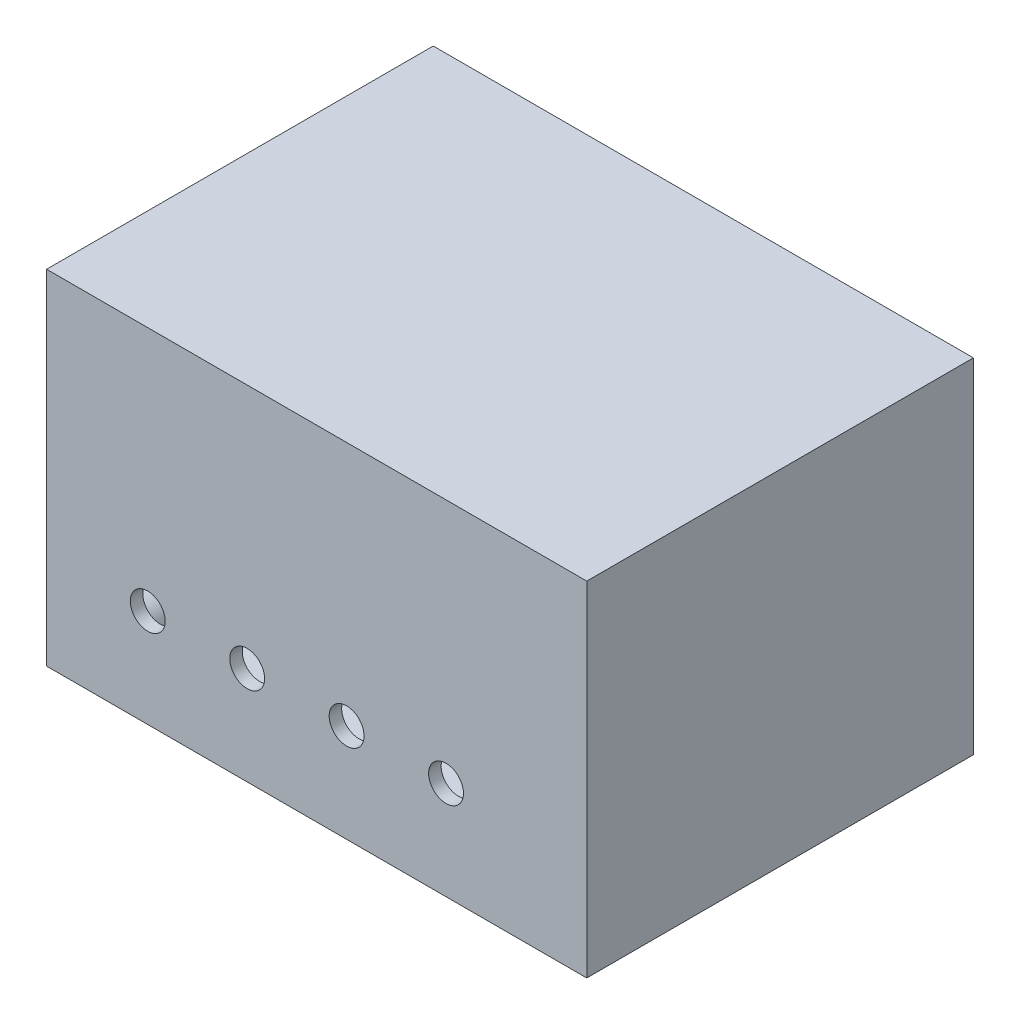
ISO-10303-21;
HEADER;
FILE_DESCRIPTION(('STEP AP214'),'2;1');
FILE_NAME('part.step','',(''),(''),'','','');
FILE_SCHEMA(('AUTOMOTIVE_DESIGN { 1 0 10303 214 1 1 1 1 }'));
ENDSEC;
DATA;
#1=APPLICATION_CONTEXT('core data for automotive mechanical design processes');
#2=APPLICATION_PROTOCOL_DEFINITION('international standard','automotive_design',2000,#1);
#3=PRODUCT_CONTEXT('',#1,'mechanical');
#4=PRODUCT('Part','Part','',(#3));
#5=PRODUCT_RELATED_PRODUCT_CATEGORY('part','',(#4));
#6=PRODUCT_DEFINITION_FORMATION('','',#4);
#7=PRODUCT_DEFINITION_CONTEXT('part definition',#1,'design');
#8=PRODUCT_DEFINITION('design','',#6,#7);
#9=PRODUCT_DEFINITION_SHAPE('','',#8);
#10=(LENGTH_UNIT() NAMED_UNIT(*) SI_UNIT(.MILLI.,.METRE.));
#11=(NAMED_UNIT(*) PLANE_ANGLE_UNIT() SI_UNIT($,.RADIAN.));
#12=(NAMED_UNIT(*) SI_UNIT($,.STERADIAN.) SOLID_ANGLE_UNIT());
#13=UNCERTAINTY_MEASURE_WITH_UNIT(LENGTH_MEASURE(1.E-05),#10,'distance_accuracy_value','');
#14=(GEOMETRIC_REPRESENTATION_CONTEXT(3) GLOBAL_UNCERTAINTY_ASSIGNED_CONTEXT((#13)) GLOBAL_UNIT_ASSIGNED_CONTEXT((#10,
#11,#12)) REPRESENTATION_CONTEXT('',''));
#15=CARTESIAN_POINT('',(0.,0.,0.));
#16=DIRECTION('',(0.,0.,1.));
#17=DIRECTION('',(1.,0.,0.));
#18=AXIS2_PLACEMENT_3D('',#15,#16,#17);
#19=CARTESIAN_POINT('',(-58.1808030552985,27.5798446644045,2.54));
#20=DIRECTION('',(1.,0.,0.));
#21=DIRECTION('',(0.,1.,0.));
#22=AXIS2_PLACEMENT_3D('',#19,#20,#21);
#23=PLANE('',#22);
#24=DIRECTION('',(0.,0.,-1.));
#25=VECTOR('',#24,1.);
#26=CARTESIAN_POINT('',(-58.1808030552985,27.5798446644045,2.54));
#27=LINE('',#26,#25);
#28=CARTESIAN_POINT('',(-58.1808030552985,27.5798446644045,2.54));
#29=VERTEX_POINT('',#28);
#30=CARTESIAN_POINT('',(-58.1808030552985,27.5798446644045,-76.2));
#31=VERTEX_POINT('',#30);
#32=EDGE_CURVE('E186',#29,#31,#27,.T.);
#33=ORIENTED_EDGE('',*,*,#32,.T.);
#34=DIRECTION('',(0.,1.,0.));
#35=VECTOR('',#34,1.);
#36=CARTESIAN_POINT('',(-58.1808030552985,-42.4201553355955,-76.2));
#37=LINE('',#36,#35);
#38=CARTESIAN_POINT('',(-58.1808030552985,-42.4201553355955,-76.2));
#39=VERTEX_POINT('',#38);
#40=EDGE_CURVE('E163',#39,#31,#37,.T.);
#41=ORIENTED_EDGE('',*,*,#40,.F.);
#42=DIRECTION('',(0.,0.,-1.));
#43=VECTOR('',#42,1.);
#44=CARTESIAN_POINT('',(-58.1808030552985,-42.4201553355955,2.54));
#45=LINE('',#44,#43);
#46=CARTESIAN_POINT('',(-58.1808030552985,-42.4201553355955,2.54));
#47=VERTEX_POINT('',#46);
#48=EDGE_CURVE('E195',#47,#39,#45,.T.);
#49=ORIENTED_EDGE('',*,*,#48,.F.);
#50=DIRECTION('',(0.,-1.,0.));
#51=VECTOR('',#50,1.);
#52=CARTESIAN_POINT('',(-58.1808030552985,27.5798446644045,2.54));
#53=LINE('',#52,#51);
#54=EDGE_CURVE('E175',#29,#47,#53,.T.);
#55=ORIENTED_EDGE('',*,*,#54,.F.);
#56=EDGE_LOOP('',(#33,#41,#49,#55));
#57=FACE_BOUND('',#56,.T.);
#58=ADVANCED_FACE('F39',(#57),#23,.F.);
#59=CARTESIAN_POINT('',(-58.1808030552985,-42.4201553355955,2.54));
#60=DIRECTION('',(0.,1.,0.));
#61=DIRECTION('',(0.,0.,1.));
#62=AXIS2_PLACEMENT_3D('',#59,#60,#61);
#63=PLANE('',#62);
#64=ORIENTED_EDGE('',*,*,#48,.T.);
#65=DIRECTION('',(-1.,0.,0.));
#66=VECTOR('',#65,1.);
#67=CARTESIAN_POINT('',(51.8191969447015,-42.4201553355955,-76.2));
#68=LINE('',#67,#66);
#69=CARTESIAN_POINT('',(51.8191969447015,-42.4201553355955,-76.2));
#70=VERTEX_POINT('',#69);
#71=EDGE_CURVE('E124',#70,#39,#68,.T.);
#72=ORIENTED_EDGE('',*,*,#71,.F.);
#73=DIRECTION('',(0.,0.,-1.));
#74=VECTOR('',#73,1.);
#75=CARTESIAN_POINT('',(51.8191969447015,-42.4201553355955,2.54));
#76=LINE('',#75,#74);
#77=CARTESIAN_POINT('',(51.8191969447015,-42.4201553355955,2.54));
#78=VERTEX_POINT('',#77);
#79=EDGE_CURVE('E192',#78,#70,#76,.T.);
#80=ORIENTED_EDGE('',*,*,#79,.F.);
#81=DIRECTION('',(1.,0.,0.));
#82=VECTOR('',#81,1.);
#83=CARTESIAN_POINT('',(-58.1808030552985,-42.4201553355955,2.54));
#84=LINE('',#83,#82);
#85=EDGE_CURVE('E178',#47,#78,#84,.T.);
#86=ORIENTED_EDGE('',*,*,#85,.F.);
#87=EDGE_LOOP('',(#64,#72,#80,#86));
#88=FACE_BOUND('',#87,.T.);
#89=ADVANCED_FACE('F236',(#88),#63,.F.);
#90=CARTESIAN_POINT('',(51.8191969447015,27.5798446644045,2.54));
#91=DIRECTION('',(-1.,0.,0.));
#92=DIRECTION('',(0.,-1.,0.));
#93=AXIS2_PLACEMENT_3D('',#90,#91,#92);
#94=PLANE('',#93);
#95=ORIENTED_EDGE('',*,*,#79,.T.);
#96=DIRECTION('',(0.,-1.,0.));
#97=VECTOR('',#96,1.);
#98=CARTESIAN_POINT('',(51.8191969447015,27.5798446644045,-76.2));
#99=LINE('',#98,#97);
#100=CARTESIAN_POINT('',(51.8191969447015,27.5798446644045,-76.2));
#101=VERTEX_POINT('',#100);
#102=EDGE_CURVE('E171',#101,#70,#99,.T.);
#103=ORIENTED_EDGE('',*,*,#102,.F.);
#104=DIRECTION('',(0.,0.,-1.));
#105=VECTOR('',#104,1.);
#106=CARTESIAN_POINT('',(51.8191969447015,27.5798446644045,2.54));
#107=LINE('',#106,#105);
#108=CARTESIAN_POINT('',(51.8191969447015,27.5798446644045,2.54));
#109=VERTEX_POINT('',#108);
#110=EDGE_CURVE('E189',#109,#101,#107,.T.);
#111=ORIENTED_EDGE('',*,*,#110,.F.);
#112=DIRECTION('',(0.,1.,0.));
#113=VECTOR('',#112,1.);
#114=CARTESIAN_POINT('',(51.8191969447015,27.5798446644045,2.54));
#115=LINE('',#114,#113);
#116=EDGE_CURVE('E181',#78,#109,#115,.T.);
#117=ORIENTED_EDGE('',*,*,#116,.F.);
#118=EDGE_LOOP('',(#95,#103,#111,#117));
#119=FACE_BOUND('',#118,.T.);
#120=ADVANCED_FACE('F241',(#119),#94,.F.);
#121=CARTESIAN_POINT('',(-58.1808030552985,27.5798446644045,2.54));
#122=DIRECTION('',(0.,-1.,0.));
#123=DIRECTION('',(0.,0.,-1.));
#124=AXIS2_PLACEMENT_3D('',#121,#122,#123);
#125=PLANE('',#124);
#126=ORIENTED_EDGE('',*,*,#110,.T.);
#127=DIRECTION('',(1.,0.,0.));
#128=VECTOR('',#127,1.);
#129=CARTESIAN_POINT('',(-58.1808030552985,27.5798446644045,-76.2));
#130=LINE('',#129,#128);
#131=EDGE_CURVE('E167',#31,#101,#130,.T.);
#132=ORIENTED_EDGE('',*,*,#131,.F.);
#133=ORIENTED_EDGE('',*,*,#32,.F.);
#134=DIRECTION('',(-1.,0.,0.));
#135=VECTOR('',#134,1.);
#136=CARTESIAN_POINT('',(-58.1808030552985,27.5798446644045,2.54));
#137=LINE('',#136,#135);
#138=EDGE_CURVE('E62',#109,#29,#137,.T.);
#139=ORIENTED_EDGE('',*,*,#138,.F.);
#140=EDGE_LOOP('',(#126,#132,#133,#139));
#141=FACE_BOUND('',#140,.T.);
#142=ADVANCED_FACE('F251',(#141),#125,.F.);
#143=CARTESIAN_POINT('',(0.,0.,2.54));
#144=DIRECTION('',(0.,0.,1.));
#145=DIRECTION('',(1.,0.,0.));
#146=AXIS2_PLACEMENT_3D('',#143,#144,#145);
#147=PLANE('',#146);
#148=CARTESIAN_POINT('',(23.1691969447015,-22.4201553355955,2.54));
#149=DIRECTION('',(0.,0.,1.));
#150=DIRECTION('',(1.,0.,0.));
#151=AXIS2_PLACEMENT_3D('',#148,#149,#150);
#152=CIRCLE('',#151,3.55);
#153=CARTESIAN_POINT('',(26.7191969447015,-22.4201553355955,2.54));
#154=VERTEX_POINT('',#153);
#155=EDGE_CURVE('E521',#154,#154,#152,.T.);
#156=ORIENTED_EDGE('',*,*,#155,.F.);
#157=EDGE_LOOP('',(#156));
#158=FACE_BOUND('',#157,.T.);
#159=CARTESIAN_POINT('',(2.91919694470147,-22.4201553355955,2.54));
#160=DIRECTION('',(0.,0.,1.));
#161=DIRECTION('',(1.,0.,0.));
#162=AXIS2_PLACEMENT_3D('',#159,#160,#161);
#163=CIRCLE('',#162,3.55);
#164=CARTESIAN_POINT('',(6.46919694470147,-22.4201553355955,2.54));
#165=VERTEX_POINT('',#164);
#166=EDGE_CURVE('E530',#165,#165,#163,.T.);
#167=ORIENTED_EDGE('',*,*,#166,.F.);
#168=EDGE_LOOP('',(#167));
#169=FACE_BOUND('',#168,.T.);
#170=CARTESIAN_POINT('',(-17.3308030552985,-22.4201553355955,2.54));
#171=DIRECTION('',(0.,0.,1.));
#172=DIRECTION('',(1.,0.,0.));
#173=AXIS2_PLACEMENT_3D('',#170,#171,#172);
#174=CIRCLE('',#173,3.55);
#175=CARTESIAN_POINT('',(-13.7808030552985,-22.4201553355955,2.54));
#176=VERTEX_POINT('',#175);
#177=EDGE_CURVE('E540',#176,#176,#174,.T.);
#178=ORIENTED_EDGE('',*,*,#177,.F.);
#179=EDGE_LOOP('',(#178));
#180=FACE_BOUND('',#179,.T.);
#181=CARTESIAN_POINT('',(-37.5808030552985,-22.4201553355955,2.54));
#182=DIRECTION('',(0.,0.,1.));
#183=DIRECTION('',(1.,0.,0.));
#184=AXIS2_PLACEMENT_3D('',#181,#182,#183);
#185=CIRCLE('',#184,3.55);
#186=CARTESIAN_POINT('',(-34.0308030552985,-22.4201553355955,2.54));
#187=VERTEX_POINT('',#186);
#188=EDGE_CURVE('E548',#187,#187,#185,.T.);
#189=ORIENTED_EDGE('',*,*,#188,.F.);
#190=EDGE_LOOP('',(#189));
#191=FACE_BOUND('',#190,.T.);
#192=ORIENTED_EDGE('',*,*,#54,.T.);
#193=ORIENTED_EDGE('',*,*,#85,.T.);
#194=ORIENTED_EDGE('',*,*,#116,.T.);
#195=ORIENTED_EDGE('',*,*,#138,.T.);
#196=EDGE_LOOP('',(#192,#193,#194,#195));
#197=FACE_BOUND('',#196,.T.);
#198=ADVANCED_FACE('F256',(#158,#169,#180,#191,#197),#147,.T.);
#199=CARTESIAN_POINT('',(0.,0.,-76.2));
#200=DIRECTION('',(0.,0.,-1.));
#201=DIRECTION('',(-1.,0.,0.));
#202=AXIS2_PLACEMENT_3D('',#199,#200,#201);
#203=PLANE('',#202);
#204=ORIENTED_EDGE('',*,*,#71,.T.);
#205=ORIENTED_EDGE('',*,*,#40,.T.);
#206=ORIENTED_EDGE('',*,*,#131,.T.);
#207=ORIENTED_EDGE('',*,*,#102,.T.);
#208=EDGE_LOOP('',(#204,#205,#206,#207));
#209=FACE_BOUND('',#208,.T.);
#210=DIRECTION('',(0.,1.,0.));
#211=VECTOR('',#210,1.);
#212=CARTESIAN_POINT('',(-55.6808030552985,-39.9201553355955,-76.2));
#213=LINE('',#212,#211);
#214=CARTESIAN_POINT('',(-55.6808030552985,-39.9201553355955,-76.2));
#215=VERTEX_POINT('',#214);
#216=CARTESIAN_POINT('',(-55.6808030552985,25.0798446644045,-76.2));
#217=VERTEX_POINT('',#216);
#218=EDGE_CURVE('E115',#215,#217,#213,.T.);
#219=ORIENTED_EDGE('',*,*,#218,.F.);
#220=DIRECTION('',(-1.,0.,0.));
#221=VECTOR('',#220,1.);
#222=CARTESIAN_POINT('',(49.3191969447015,-39.9201553355955,-76.2));
#223=LINE('',#222,#221);
#224=CARTESIAN_POINT('',(49.3191969447015,-39.9201553355955,-76.2));
#225=VERTEX_POINT('',#224);
#226=EDGE_CURVE('E106',#225,#215,#223,.T.);
#227=ORIENTED_EDGE('',*,*,#226,.F.);
#228=DIRECTION('',(0.,-1.,0.));
#229=VECTOR('',#228,1.);
#230=CARTESIAN_POINT('',(49.3191969447015,25.0798446644045,-76.2));
#231=LINE('',#230,#229);
#232=CARTESIAN_POINT('',(49.3191969447015,25.0798446644045,-76.2));
#233=VERTEX_POINT('',#232);
#234=EDGE_CURVE('E134',#233,#225,#231,.T.);
#235=ORIENTED_EDGE('',*,*,#234,.F.);
#236=DIRECTION('',(1.,0.,0.));
#237=VECTOR('',#236,1.);
#238=CARTESIAN_POINT('',(-55.6808030552985,25.0798446644045,-76.2));
#239=LINE('',#238,#237);
#240=EDGE_CURVE('E130',#217,#233,#239,.T.);
#241=ORIENTED_EDGE('',*,*,#240,.F.);
#242=EDGE_LOOP('',(#219,#227,#235,#241));
#243=FACE_BOUND('',#242,.T.);
#244=ADVANCED_FACE('F128',(#209,#243),#203,.T.);
#245=CARTESIAN_POINT('',(49.3191969447015,-39.9201553355955,-76.2));
#246=DIRECTION('',(0.,1.,0.));
#247=DIRECTION('',(-1.,0.,0.));
#248=AXIS2_PLACEMENT_3D('',#245,#246,#247);
#249=PLANE('',#248);
#250=DIRECTION('',(-1.,0.,0.));
#251=VECTOR('',#250,1.);
#252=CARTESIAN_POINT('',(49.3191969447015,-39.9201553355955,0.));
#253=LINE('',#252,#251);
#254=CARTESIAN_POINT('',(49.3191969447015,-39.9201553355955,0.));
#255=VERTEX_POINT('',#254);
#256=CARTESIAN_POINT('',(-55.6808030552985,-39.9201553355955,0.));
#257=VERTEX_POINT('',#256);
#258=EDGE_CURVE('E140',#255,#257,#253,.T.);
#259=ORIENTED_EDGE('',*,*,#258,.F.);
#260=DIRECTION('',(0.,0.,1.));
#261=VECTOR('',#260,1.);
#262=CARTESIAN_POINT('',(49.3191969447015,-39.9201553355955,-76.2));
#263=LINE('',#262,#261);
#264=EDGE_CURVE('E54',#225,#255,#263,.T.);
#265=ORIENTED_EDGE('',*,*,#264,.F.);
#266=ORIENTED_EDGE('',*,*,#226,.T.);
#267=DIRECTION('',(0.,0.,1.));
#268=VECTOR('',#267,1.);
#269=CARTESIAN_POINT('',(-55.6808030552985,-39.9201553355955,-76.2));
#270=LINE('',#269,#268);
#271=EDGE_CURVE('E109',#215,#257,#270,.T.);
#272=ORIENTED_EDGE('',*,*,#271,.T.);
#273=EDGE_LOOP('',(#259,#265,#266,#272));
#274=FACE_BOUND('',#273,.T.);
#275=ADVANCED_FACE('F108',(#274),#249,.T.);
#276=CARTESIAN_POINT('',(-55.6808030552985,-39.9201553355955,-76.2));
#277=DIRECTION('',(1.,0.,0.));
#278=DIRECTION('',(0.,1.,0.));
#279=AXIS2_PLACEMENT_3D('',#276,#277,#278);
#280=PLANE('',#279);
#281=DIRECTION('',(0.,1.,0.));
#282=VECTOR('',#281,1.);
#283=CARTESIAN_POINT('',(-55.6808030552985,-39.9201553355955,0.));
#284=LINE('',#283,#282);
#285=CARTESIAN_POINT('',(-55.6808030552985,25.0798446644045,0.));
#286=VERTEX_POINT('',#285);
#287=EDGE_CURVE('E122',#257,#286,#284,.T.);
#288=ORIENTED_EDGE('',*,*,#287,.F.);
#289=ORIENTED_EDGE('',*,*,#271,.F.);
#290=ORIENTED_EDGE('',*,*,#218,.T.);
#291=DIRECTION('',(0.,0.,1.));
#292=VECTOR('',#291,1.);
#293=CARTESIAN_POINT('',(-55.6808030552985,25.0798446644045,-76.2));
#294=LINE('',#293,#292);
#295=EDGE_CURVE('E125',#217,#286,#294,.T.);
#296=ORIENTED_EDGE('',*,*,#295,.T.);
#297=EDGE_LOOP('',(#288,#289,#290,#296));
#298=FACE_BOUND('',#297,.T.);
#299=ADVANCED_FACE('F119',(#298),#280,.T.);
#300=CARTESIAN_POINT('',(-55.6808030552985,25.0798446644045,-76.2));
#301=DIRECTION('',(0.,-1.,0.));
#302=DIRECTION('',(1.,0.,0.));
#303=AXIS2_PLACEMENT_3D('',#300,#301,#302);
#304=PLANE('',#303);
#305=DIRECTION('',(1.,0.,0.));
#306=VECTOR('',#305,1.);
#307=CARTESIAN_POINT('',(-55.6808030552985,25.0798446644045,0.));
#308=LINE('',#307,#306);
#309=CARTESIAN_POINT('',(49.3191969447015,25.0798446644045,0.));
#310=VERTEX_POINT('',#309);
#311=EDGE_CURVE('E146',#286,#310,#308,.T.);
#312=ORIENTED_EDGE('',*,*,#311,.F.);
#313=ORIENTED_EDGE('',*,*,#295,.F.);
#314=ORIENTED_EDGE('',*,*,#240,.T.);
#315=DIRECTION('',(0.,0.,1.));
#316=VECTOR('',#315,1.);
#317=CARTESIAN_POINT('',(49.3191969447015,25.0798446644045,-76.2));
#318=LINE('',#317,#316);
#319=EDGE_CURVE('E155',#233,#310,#318,.T.);
#320=ORIENTED_EDGE('',*,*,#319,.T.);
#321=EDGE_LOOP('',(#312,#313,#314,#320));
#322=FACE_BOUND('',#321,.T.);
#323=ADVANCED_FACE('F226',(#322),#304,.T.);
#324=CARTESIAN_POINT('',(49.3191969447015,25.0798446644045,-76.2));
#325=DIRECTION('',(-1.,0.,0.));
#326=DIRECTION('',(0.,-1.,0.));
#327=AXIS2_PLACEMENT_3D('',#324,#325,#326);
#328=PLANE('',#327);
#329=DIRECTION('',(0.,-1.,0.));
#330=VECTOR('',#329,1.);
#331=CARTESIAN_POINT('',(49.3191969447015,25.0798446644045,0.));
#332=LINE('',#331,#330);
#333=EDGE_CURVE('E116',#310,#255,#332,.T.);
#334=ORIENTED_EDGE('',*,*,#333,.F.);
#335=ORIENTED_EDGE('',*,*,#319,.F.);
#336=ORIENTED_EDGE('',*,*,#234,.T.);
#337=ORIENTED_EDGE('',*,*,#264,.T.);
#338=EDGE_LOOP('',(#334,#335,#336,#337));
#339=FACE_BOUND('',#338,.T.);
#340=ADVANCED_FACE('F215',(#339),#328,.T.);
#341=CARTESIAN_POINT('',(0.,0.,0.));
#342=DIRECTION('',(0.,0.,1.));
#343=DIRECTION('',(1.,0.,0.));
#344=AXIS2_PLACEMENT_3D('',#341,#342,#343);
#345=PLANE('',#344);
#346=CARTESIAN_POINT('',(23.1691969447015,-22.4201553355955,0.));
#347=DIRECTION('',(0.,0.,1.));
#348=DIRECTION('',(1.,0.,0.));
#349=AXIS2_PLACEMENT_3D('',#346,#347,#348);
#350=CIRCLE('',#349,3.55);
#351=CARTESIAN_POINT('',(26.7191969447015,-22.4201553355955,0.));
#352=VERTEX_POINT('',#351);
#353=EDGE_CURVE('E519',#352,#352,#350,.T.);
#354=ORIENTED_EDGE('',*,*,#353,.T.);
#355=EDGE_LOOP('',(#354));
#356=FACE_BOUND('',#355,.T.);
#357=CARTESIAN_POINT('',(2.91919694470147,-22.4201553355955,0.));
#358=DIRECTION('',(0.,0.,1.));
#359=DIRECTION('',(1.,0.,0.));
#360=AXIS2_PLACEMENT_3D('',#357,#358,#359);
#361=CIRCLE('',#360,3.55);
#362=CARTESIAN_POINT('',(6.46919694470147,-22.4201553355955,0.));
#363=VERTEX_POINT('',#362);
#364=EDGE_CURVE('E523',#363,#363,#361,.T.);
#365=ORIENTED_EDGE('',*,*,#364,.T.);
#366=EDGE_LOOP('',(#365));
#367=FACE_BOUND('',#366,.T.);
#368=CARTESIAN_POINT('',(-17.3308030552985,-22.4201553355955,0.));
#369=DIRECTION('',(0.,0.,1.));
#370=DIRECTION('',(1.,0.,0.));
#371=AXIS2_PLACEMENT_3D('',#368,#369,#370);
#372=CIRCLE('',#371,3.55);
#373=CARTESIAN_POINT('',(-13.7808030552985,-22.4201553355955,0.));
#374=VERTEX_POINT('',#373);
#375=EDGE_CURVE('E536',#374,#374,#372,.T.);
#376=ORIENTED_EDGE('',*,*,#375,.T.);
#377=EDGE_LOOP('',(#376));
#378=FACE_BOUND('',#377,.T.);
#379=CARTESIAN_POINT('',(-37.5808030552985,-22.4201553355955,0.));
#380=DIRECTION('',(0.,0.,1.));
#381=DIRECTION('',(1.,0.,0.));
#382=AXIS2_PLACEMENT_3D('',#379,#380,#381);
#383=CIRCLE('',#382,3.55);
#384=CARTESIAN_POINT('',(-34.0308030552985,-22.4201553355955,0.));
#385=VERTEX_POINT('',#384);
#386=EDGE_CURVE('E544',#385,#385,#383,.T.);
#387=ORIENTED_EDGE('',*,*,#386,.T.);
#388=EDGE_LOOP('',(#387));
#389=FACE_BOUND('',#388,.T.);
#390=CARTESIAN_POINT('',(43.8191969447015,-32.4201553355955,0.));
#391=DIRECTION('',(0.,0.,1.));
#392=DIRECTION('',(1.,0.,0.));
#393=AXIS2_PLACEMENT_3D('',#390,#391,#392);
#394=CIRCLE('',#393,5.31);
#395=CARTESIAN_POINT('',(49.1291969447014,-32.4201553355955,0.));
#396=VERTEX_POINT('',#395);
#397=EDGE_CURVE('E11',#396,#396,#394,.F.);
#398=ORIENTED_EDGE('',*,*,#397,.F.);
#399=EDGE_LOOP('',(#398));
#400=FACE_BOUND('',#399,.T.);
#401=CARTESIAN_POINT('',(-47.1808030552985,-32.4201553355955,0.));
#402=DIRECTION('',(0.,0.,1.));
#403=DIRECTION('',(1.,0.,0.));
#404=AXIS2_PLACEMENT_3D('',#401,#402,#403);
#405=CIRCLE('',#404,5.31);
#406=CARTESIAN_POINT('',(-41.8708030552985,-32.4201553355955,0.));
#407=VERTEX_POINT('',#406);
#408=EDGE_CURVE('E47',#407,#407,#405,.F.);
#409=ORIENTED_EDGE('',*,*,#408,.F.);
#410=EDGE_LOOP('',(#409));
#411=FACE_BOUND('',#410,.T.);
#412=CARTESIAN_POINT('',(-47.1808030552985,17.5798446644045,0.));
#413=DIRECTION('',(0.,0.,1.));
#414=DIRECTION('',(1.,0.,0.));
#415=AXIS2_PLACEMENT_3D('',#412,#413,#414);
#416=CIRCLE('',#415,5.31);
#417=CARTESIAN_POINT('',(-41.8708030552985,17.5798446644045,0.));
#418=VERTEX_POINT('',#417);
#419=EDGE_CURVE('E202',#418,#418,#416,.F.);
#420=ORIENTED_EDGE('',*,*,#419,.F.);
#421=EDGE_LOOP('',(#420));
#422=FACE_BOUND('',#421,.T.);
#423=CARTESIAN_POINT('',(43.8191969447015,17.5798446644045,0.));
#424=DIRECTION('',(0.,0.,1.));
#425=DIRECTION('',(1.,0.,0.));
#426=AXIS2_PLACEMENT_3D('',#423,#424,#425);
#427=CIRCLE('',#426,5.31);
#428=CARTESIAN_POINT('',(49.1291969447014,17.5798446644045,0.));
#429=VERTEX_POINT('',#428);
#430=EDGE_CURVE('E198',#429,#429,#427,.F.);
#431=ORIENTED_EDGE('',*,*,#430,.F.);
#432=EDGE_LOOP('',(#431));
#433=FACE_BOUND('',#432,.T.);
#434=ORIENTED_EDGE('',*,*,#333,.T.);
#435=ORIENTED_EDGE('',*,*,#258,.T.);
#436=ORIENTED_EDGE('',*,*,#287,.T.);
#437=ORIENTED_EDGE('',*,*,#311,.T.);
#438=EDGE_LOOP('',(#434,#435,#436,#437));
#439=FACE_BOUND('',#438,.T.);
#440=ADVANCED_FACE('F211',(#356,#367,#378,#389,#400,#411,#422,#433,#439),#345,.F.);
#441=CARTESIAN_POINT('',(43.8191969447015,17.5798446644045,-10.));
#442=DIRECTION('',(0.,0.,1.));
#443=DIRECTION('',(1.,0.,0.));
#444=AXIS2_PLACEMENT_3D('',#441,#442,#443);
#445=CYLINDRICAL_SURFACE('',#444,2.76999999999999);
#446=CARTESIAN_POINT('',(43.8191969447015,17.5798446644045,-10.));
#447=DIRECTION('',(0.,0.,-1.));
#448=DIRECTION('',(-1.,0.,0.));
#449=AXIS2_PLACEMENT_3D('',#446,#447,#448);
#450=CIRCLE('',#449,2.76999999999999);
#451=CARTESIAN_POINT('',(41.0491969447015,17.5798446644045,-10.));
#452=VERTEX_POINT('',#451);
#453=EDGE_CURVE('E588',#452,#452,#450,.T.);
#454=ORIENTED_EDGE('',*,*,#453,.T.);
#455=EDGE_LOOP('',(#454));
#456=FACE_BOUND('',#455,.T.);
#457=CARTESIAN_POINT('',(43.8191969447015,17.5798446644045,0.));
#458=DIRECTION('',(0.,0.,-1.));
#459=DIRECTION('',(-1.,0.,0.));
#460=AXIS2_PLACEMENT_3D('',#457,#458,#459);
#461=CIRCLE('',#460,2.76999999999999);
#462=CARTESIAN_POINT('',(41.0491969447015,17.5798446644045,0.));
#463=VERTEX_POINT('',#462);
#464=EDGE_CURVE('E584',#463,#463,#461,.T.);
#465=ORIENTED_EDGE('',*,*,#464,.F.);
#466=EDGE_LOOP('',(#465));
#467=FACE_BOUND('',#466,.T.);
#468=ADVANCED_FACE('F214',(#456,#467),#445,.F.);
#469=CARTESIAN_POINT('',(43.8191969447015,17.5798446644045,-10.));
#470=DIRECTION('',(0.,0.,1.));
#471=DIRECTION('',(1.,0.,0.));
#472=AXIS2_PLACEMENT_3D('',#469,#470,#471);
#473=CYLINDRICAL_SURFACE('',#472,5.31);
#474=CARTESIAN_POINT('',(43.8191969447015,17.5798446644045,-10.));
#475=DIRECTION('',(0.,0.,-1.));
#476=DIRECTION('',(-1.,0.,0.));
#477=AXIS2_PLACEMENT_3D('',#474,#475,#476);
#478=CIRCLE('',#477,5.31);
#479=CARTESIAN_POINT('',(38.5091969447015,17.5798446644045,-10.));
#480=VERTEX_POINT('',#479);
#481=EDGE_CURVE('E143',#480,#480,#478,.T.);
#482=ORIENTED_EDGE('',*,*,#481,.F.);
#483=EDGE_LOOP('',(#482));
#484=FACE_BOUND('',#483,.T.);
#485=ORIENTED_EDGE('',*,*,#430,.T.);
#486=EDGE_LOOP('',(#485));
#487=FACE_BOUND('',#486,.T.);
#488=ADVANCED_FACE('F319',(#484,#487),#473,.T.);
#489=CARTESIAN_POINT('',(0.,0.,-10.));
#490=DIRECTION('',(0.,0.,-1.));
#491=DIRECTION('',(-1.,0.,0.));
#492=AXIS2_PLACEMENT_3D('',#489,#490,#491);
#493=PLANE('',#492);
#494=ORIENTED_EDGE('',*,*,#453,.F.);
#495=EDGE_LOOP('',(#494));
#496=FACE_BOUND('',#495,.T.);
#497=ORIENTED_EDGE('',*,*,#481,.T.);
#498=EDGE_LOOP('',(#497));
#499=FACE_BOUND('',#498,.T.);
#500=ADVANCED_FACE('F330',(#496,#499),#493,.T.);
#501=ORIENTED_EDGE('',*,*,#464,.T.);
#502=EDGE_LOOP('',(#501));
#503=FACE_BOUND('',#502,.T.);
#504=ADVANCED_FACE('F219',(#503),#345,.F.);
#505=CARTESIAN_POINT('',(-47.1808030552985,17.5798446644045,-10.));
#506=DIRECTION('',(0.,0.,1.));
#507=DIRECTION('',(1.,0.,0.));
#508=AXIS2_PLACEMENT_3D('',#505,#506,#507);
#509=CYLINDRICAL_SURFACE('',#508,2.77);
#510=CARTESIAN_POINT('',(-47.1808030552985,17.5798446644045,-10.));
#511=DIRECTION('',(0.,0.,-1.));
#512=DIRECTION('',(-1.,0.,0.));
#513=AXIS2_PLACEMENT_3D('',#510,#511,#512);
#514=CIRCLE('',#513,2.77);
#515=CARTESIAN_POINT('',(-49.9508030552985,17.5798446644045,-10.));
#516=VERTEX_POINT('',#515);
#517=EDGE_CURVE('E576',#516,#516,#514,.T.);
#518=ORIENTED_EDGE('',*,*,#517,.T.);
#519=EDGE_LOOP('',(#518));
#520=FACE_BOUND('',#519,.T.);
#521=CARTESIAN_POINT('',(-47.1808030552985,17.5798446644045,0.));
#522=DIRECTION('',(0.,0.,-1.));
#523=DIRECTION('',(-1.,0.,0.));
#524=AXIS2_PLACEMENT_3D('',#521,#522,#523);
#525=CIRCLE('',#524,2.77);
#526=CARTESIAN_POINT('',(-49.9508030552985,17.5798446644045,0.));
#527=VERTEX_POINT('',#526);
#528=EDGE_CURVE('E572',#527,#527,#525,.T.);
#529=ORIENTED_EDGE('',*,*,#528,.F.);
#530=EDGE_LOOP('',(#529));
#531=FACE_BOUND('',#530,.T.);
#532=ADVANCED_FACE('F349',(#520,#531),#509,.F.);
#533=CARTESIAN_POINT('',(-47.1808030552985,17.5798446644045,-10.));
#534=DIRECTION('',(0.,0.,1.));
#535=DIRECTION('',(1.,0.,0.));
#536=AXIS2_PLACEMENT_3D('',#533,#534,#535);
#537=CYLINDRICAL_SURFACE('',#536,5.31);
#538=CARTESIAN_POINT('',(-47.1808030552985,17.5798446644045,-10.));
#539=DIRECTION('',(0.,0.,-1.));
#540=DIRECTION('',(-1.,0.,0.));
#541=AXIS2_PLACEMENT_3D('',#538,#539,#540);
#542=CIRCLE('',#541,5.31);
#543=CARTESIAN_POINT('',(-52.4908030552985,17.5798446644045,-10.));
#544=VERTEX_POINT('',#543);
#545=EDGE_CURVE('E580',#544,#544,#542,.T.);
#546=ORIENTED_EDGE('',*,*,#545,.F.);
#547=EDGE_LOOP('',(#546));
#548=FACE_BOUND('',#547,.T.);
#549=ORIENTED_EDGE('',*,*,#419,.T.);
#550=EDGE_LOOP('',(#549));
#551=FACE_BOUND('',#550,.T.);
#552=ADVANCED_FACE('F359',(#548,#551),#537,.T.);
#553=CARTESIAN_POINT('',(0.,0.,-10.));
#554=DIRECTION('',(0.,0.,-1.));
#555=DIRECTION('',(-1.,0.,0.));
#556=AXIS2_PLACEMENT_3D('',#553,#554,#555);
#557=PLANE('',#556);
#558=ORIENTED_EDGE('',*,*,#517,.F.);
#559=EDGE_LOOP('',(#558));
#560=FACE_BOUND('',#559,.T.);
#561=ORIENTED_EDGE('',*,*,#545,.T.);
#562=EDGE_LOOP('',(#561));
#563=FACE_BOUND('',#562,.T.);
#564=ADVANCED_FACE('F369',(#560,#563),#557,.T.);
#565=ORIENTED_EDGE('',*,*,#528,.T.);
#566=EDGE_LOOP('',(#565));
#567=FACE_BOUND('',#566,.T.);
#568=ADVANCED_FACE('F351',(#567),#345,.F.);
#569=CARTESIAN_POINT('',(-47.1808030552985,-32.4201553355955,-10.));
#570=DIRECTION('',(0.,0.,1.));
#571=DIRECTION('',(1.,0.,0.));
#572=AXIS2_PLACEMENT_3D('',#569,#570,#571);
#573=CYLINDRICAL_SURFACE('',#572,2.77);
#574=CARTESIAN_POINT('',(-47.1808030552985,-32.4201553355955,-10.));
#575=DIRECTION('',(0.,0.,-1.));
#576=DIRECTION('',(-1.,0.,0.));
#577=AXIS2_PLACEMENT_3D('',#574,#575,#576);
#578=CIRCLE('',#577,2.77);
#579=CARTESIAN_POINT('',(-49.9508030552985,-32.4201553355955,-10.));
#580=VERTEX_POINT('',#579);
#581=EDGE_CURVE('E564',#580,#580,#578,.T.);
#582=ORIENTED_EDGE('',*,*,#581,.T.);
#583=EDGE_LOOP('',(#582));
#584=FACE_BOUND('',#583,.T.);
#585=CARTESIAN_POINT('',(-47.1808030552985,-32.4201553355955,0.));
#586=DIRECTION('',(0.,0.,-1.));
#587=DIRECTION('',(-1.,0.,0.));
#588=AXIS2_PLACEMENT_3D('',#585,#586,#587);
#589=CIRCLE('',#588,2.77);
#590=CARTESIAN_POINT('',(-49.9508030552985,-32.4201553355955,0.));
#591=VERTEX_POINT('',#590);
#592=EDGE_CURVE('E560',#591,#591,#589,.T.);
#593=ORIENTED_EDGE('',*,*,#592,.F.);
#594=EDGE_LOOP('',(#593));
#595=FACE_BOUND('',#594,.T.);
#596=ADVANCED_FACE('F388',(#584,#595),#573,.F.);
#597=CARTESIAN_POINT('',(-47.1808030552985,-32.4201553355955,-10.));
#598=DIRECTION('',(0.,0.,1.));
#599=DIRECTION('',(1.,0.,0.));
#600=AXIS2_PLACEMENT_3D('',#597,#598,#599);
#601=CYLINDRICAL_SURFACE('',#600,5.31);
#602=CARTESIAN_POINT('',(-47.1808030552985,-32.4201553355955,-10.));
#603=DIRECTION('',(0.,0.,-1.));
#604=DIRECTION('',(-1.,0.,0.));
#605=AXIS2_PLACEMENT_3D('',#602,#603,#604);
#606=CIRCLE('',#605,5.31);
#607=CARTESIAN_POINT('',(-52.4908030552985,-32.4201553355955,-10.));
#608=VERTEX_POINT('',#607);
#609=EDGE_CURVE('E568',#608,#608,#606,.T.);
#610=ORIENTED_EDGE('',*,*,#609,.F.);
#611=EDGE_LOOP('',(#610));
#612=FACE_BOUND('',#611,.T.);
#613=ORIENTED_EDGE('',*,*,#408,.T.);
#614=EDGE_LOOP('',(#613));
#615=FACE_BOUND('',#614,.T.);
#616=ADVANCED_FACE('F209',(#612,#615),#601,.T.);
#617=CARTESIAN_POINT('',(0.,0.,-10.));
#618=DIRECTION('',(0.,0.,-1.));
#619=DIRECTION('',(-1.,0.,0.));
#620=AXIS2_PLACEMENT_3D('',#617,#618,#619);
#621=PLANE('',#620);
#622=ORIENTED_EDGE('',*,*,#581,.F.);
#623=EDGE_LOOP('',(#622));
#624=FACE_BOUND('',#623,.T.);
#625=ORIENTED_EDGE('',*,*,#609,.T.);
#626=EDGE_LOOP('',(#625));
#627=FACE_BOUND('',#626,.T.);
#628=ADVANCED_FACE('F407',(#624,#627),#621,.T.);
#629=ORIENTED_EDGE('',*,*,#592,.T.);
#630=EDGE_LOOP('',(#629));
#631=FACE_BOUND('',#630,.T.);
#632=ADVANCED_FACE('F390',(#631),#345,.F.);
#633=CARTESIAN_POINT('',(43.8191969447015,-32.4201553355955,-10.));
#634=DIRECTION('',(0.,0.,1.));
#635=DIRECTION('',(1.,0.,0.));
#636=AXIS2_PLACEMENT_3D('',#633,#634,#635);
#637=CYLINDRICAL_SURFACE('',#636,2.76999999999999);
#638=CARTESIAN_POINT('',(43.8191969447015,-32.4201553355955,-10.));
#639=DIRECTION('',(0.,0.,-1.));
#640=DIRECTION('',(-1.,0.,0.));
#641=AXIS2_PLACEMENT_3D('',#638,#639,#640);
#642=CIRCLE('',#641,2.76999999999999);
#643=CARTESIAN_POINT('',(41.0491969447015,-32.4201553355955,-10.));
#644=VERTEX_POINT('',#643);
#645=EDGE_CURVE('E552',#644,#644,#642,.T.);
#646=ORIENTED_EDGE('',*,*,#645,.T.);
#647=EDGE_LOOP('',(#646));
#648=FACE_BOUND('',#647,.T.);
#649=CARTESIAN_POINT('',(43.8191969447015,-32.4201553355955,0.));
#650=DIRECTION('',(0.,0.,-1.));
#651=DIRECTION('',(-1.,0.,0.));
#652=AXIS2_PLACEMENT_3D('',#649,#650,#651);
#653=CIRCLE('',#652,2.76999999999999);
#654=CARTESIAN_POINT('',(41.0491969447015,-32.4201553355955,0.));
#655=VERTEX_POINT('',#654);
#656=EDGE_CURVE('E527',#655,#655,#653,.T.);
#657=ORIENTED_EDGE('',*,*,#656,.F.);
#658=EDGE_LOOP('',(#657));
#659=FACE_BOUND('',#658,.T.);
#660=ADVANCED_FACE('F426',(#648,#659),#637,.F.);
#661=CARTESIAN_POINT('',(43.8191969447015,-32.4201553355955,-10.));
#662=DIRECTION('',(0.,0.,1.));
#663=DIRECTION('',(1.,0.,0.));
#664=AXIS2_PLACEMENT_3D('',#661,#662,#663);
#665=CYLINDRICAL_SURFACE('',#664,5.31);
#666=CARTESIAN_POINT('',(43.8191969447015,-32.4201553355955,-10.));
#667=DIRECTION('',(0.,0.,-1.));
#668=DIRECTION('',(-1.,0.,0.));
#669=AXIS2_PLACEMENT_3D('',#666,#667,#668);
#670=CIRCLE('',#669,5.31);
#671=CARTESIAN_POINT('',(38.5091969447015,-32.4201553355955,-10.));
#672=VERTEX_POINT('',#671);
#673=EDGE_CURVE('E556',#672,#672,#670,.T.);
#674=ORIENTED_EDGE('',*,*,#673,.F.);
#675=EDGE_LOOP('',(#674));
#676=FACE_BOUND('',#675,.T.);
#677=ORIENTED_EDGE('',*,*,#397,.T.);
#678=EDGE_LOOP('',(#677));
#679=FACE_BOUND('',#678,.T.);
#680=ADVANCED_FACE('F434',(#676,#679),#665,.T.);
#681=CARTESIAN_POINT('',(0.,0.,-10.));
#682=DIRECTION('',(0.,0.,-1.));
#683=DIRECTION('',(-1.,0.,0.));
#684=AXIS2_PLACEMENT_3D('',#681,#682,#683);
#685=PLANE('',#684);
#686=ORIENTED_EDGE('',*,*,#645,.F.);
#687=EDGE_LOOP('',(#686));
#688=FACE_BOUND('',#687,.T.);
#689=ORIENTED_EDGE('',*,*,#673,.T.);
#690=EDGE_LOOP('',(#689));
#691=FACE_BOUND('',#690,.T.);
#692=ADVANCED_FACE('F444',(#688,#691),#685,.T.);
#693=ORIENTED_EDGE('',*,*,#656,.T.);
#694=EDGE_LOOP('',(#693));
#695=FACE_BOUND('',#694,.T.);
#696=ADVANCED_FACE('F218',(#695),#345,.F.);
#697=CARTESIAN_POINT('',(-37.5808030552985,-22.4201553355955,0.));
#698=DIRECTION('',(0.,0.,1.));
#699=DIRECTION('',(1.,0.,0.));
#700=AXIS2_PLACEMENT_3D('',#697,#698,#699);
#701=CYLINDRICAL_SURFACE('',#700,3.55);
#702=ORIENTED_EDGE('',*,*,#386,.F.);
#703=EDGE_LOOP('',(#702));
#704=FACE_BOUND('',#703,.T.);
#705=ORIENTED_EDGE('',*,*,#188,.T.);
#706=EDGE_LOOP('',(#705));
#707=FACE_BOUND('',#706,.T.);
#708=ADVANCED_FACE('F462',(#704,#707),#701,.F.);
#709=CARTESIAN_POINT('',(-17.3308030552985,-22.4201553355955,0.));
#710=DIRECTION('',(0.,0.,1.));
#711=DIRECTION('',(1.,0.,0.));
#712=AXIS2_PLACEMENT_3D('',#709,#710,#711);
#713=CYLINDRICAL_SURFACE('',#712,3.55);
#714=ORIENTED_EDGE('',*,*,#375,.F.);
#715=EDGE_LOOP('',(#714));
#716=FACE_BOUND('',#715,.T.);
#717=ORIENTED_EDGE('',*,*,#177,.T.);
#718=EDGE_LOOP('',(#717));
#719=FACE_BOUND('',#718,.T.);
#720=ADVANCED_FACE('F482',(#716,#719),#713,.F.);
#721=CARTESIAN_POINT('',(2.91919694470147,-22.4201553355955,0.));
#722=DIRECTION('',(0.,0.,1.));
#723=DIRECTION('',(1.,0.,0.));
#724=AXIS2_PLACEMENT_3D('',#721,#722,#723);
#725=CYLINDRICAL_SURFACE('',#724,3.55);
#726=ORIENTED_EDGE('',*,*,#364,.F.);
#727=EDGE_LOOP('',(#726));
#728=FACE_BOUND('',#727,.T.);
#729=ORIENTED_EDGE('',*,*,#166,.T.);
#730=EDGE_LOOP('',(#729));
#731=FACE_BOUND('',#730,.T.);
#732=ADVANCED_FACE('F492',(#728,#731),#725,.F.);
#733=CARTESIAN_POINT('',(23.1691969447015,-22.4201553355955,0.));
#734=DIRECTION('',(0.,0.,1.));
#735=DIRECTION('',(1.,0.,0.));
#736=AXIS2_PLACEMENT_3D('',#733,#734,#735);
#737=CYLINDRICAL_SURFACE('',#736,3.55);
#738=ORIENTED_EDGE('',*,*,#353,.F.);
#739=EDGE_LOOP('',(#738));
#740=FACE_BOUND('',#739,.T.);
#741=ORIENTED_EDGE('',*,*,#155,.T.);
#742=EDGE_LOOP('',(#741));
#743=FACE_BOUND('',#742,.T.);
#744=ADVANCED_FACE('F502',(#740,#743),#737,.F.);
#745=CLOSED_SHELL('',(#58,#89,#120,#142,#198,#244,#275,#299,#323,#340,#440,#468,#488,#500,#504,
#532,#552,#564,#568,#596,#616,#628,#632,#660,#680,#692,#696,#708,#720,#732,#744));
#746=MANIFOLD_SOLID_BREP('B2',#745);
#747=ADVANCED_BREP_SHAPE_REPRESENTATION('',(#18,#746),#14);
#748=SHAPE_DEFINITION_REPRESENTATION(#9,#747);
ENDSEC;
END-ISO-10303-21;
